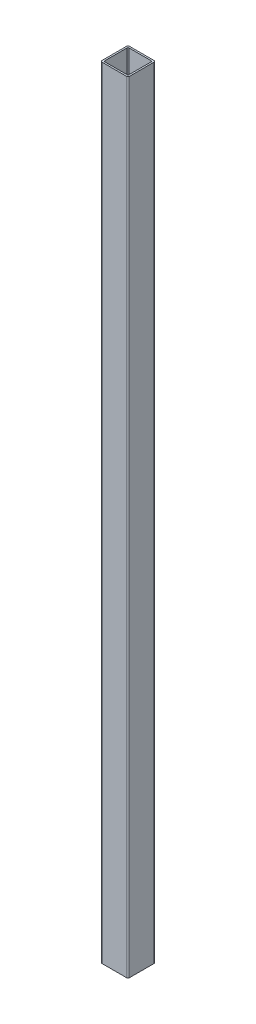
ISO-10303-21;
HEADER;
FILE_DESCRIPTION(('STEP AP214'),'2;1');
FILE_NAME('part.step','',(''),(''),'','','');
FILE_SCHEMA(('AUTOMOTIVE_DESIGN { 1 0 10303 214 1 1 1 1 }'));
ENDSEC;
DATA;
#1=APPLICATION_CONTEXT('core data for automotive mechanical design processes');
#2=APPLICATION_PROTOCOL_DEFINITION('international standard','automotive_design',2000,#1);
#3=PRODUCT_CONTEXT('',#1,'mechanical');
#4=PRODUCT('Part','Part','',(#3));
#5=PRODUCT_RELATED_PRODUCT_CATEGORY('part','',(#4));
#6=PRODUCT_DEFINITION_FORMATION('','',#4);
#7=PRODUCT_DEFINITION_CONTEXT('part definition',#1,'design');
#8=PRODUCT_DEFINITION('design','',#6,#7);
#9=PRODUCT_DEFINITION_SHAPE('','',#8);
#10=(LENGTH_UNIT() NAMED_UNIT(*) SI_UNIT(.MILLI.,.METRE.));
#11=(NAMED_UNIT(*) PLANE_ANGLE_UNIT() SI_UNIT($,.RADIAN.));
#12=(NAMED_UNIT(*) SI_UNIT($,.STERADIAN.) SOLID_ANGLE_UNIT());
#13=UNCERTAINTY_MEASURE_WITH_UNIT(LENGTH_MEASURE(1.E-05),#10,'distance_accuracy_value','');
#14=(GEOMETRIC_REPRESENTATION_CONTEXT(3) GLOBAL_UNCERTAINTY_ASSIGNED_CONTEXT((#13)) GLOBAL_UNIT_ASSIGNED_CONTEXT((#10,
#11,#12)) REPRESENTATION_CONTEXT('',''));
#15=CARTESIAN_POINT('',(0.,0.,0.));
#16=DIRECTION('',(0.,0.,1.));
#17=DIRECTION('',(1.,0.,0.));
#18=AXIS2_PLACEMENT_3D('',#15,#16,#17);
#19=CARTESIAN_POINT('',(-50.0000000000034,2983.95827270229,-43.9999999999733));
#20=DIRECTION('',(1.,0.,0.));
#21=DIRECTION('',(0.,0.,-1.));
#22=AXIS2_PLACEMENT_3D('',#19,#20,#21);
#23=PLANE('',#22);
#24=DIRECTION('',(0.,0.,1.));
#25=VECTOR('',#24,1.);
#26=CARTESIAN_POINT('',(-50.0000000000034,2842.53691646498,-43.9999999999733));
#27=LINE('',#26,#25);
#28=CARTESIAN_POINT('',(-50.0000000000034,2842.53691646498,-43.9999999999733));
#29=VERTEX_POINT('',#28);
#30=CARTESIAN_POINT('',(-50.0000000000034,2842.53691646498,44.0000000000267));
#31=VERTEX_POINT('',#30);
#32=EDGE_CURVE('E306',#29,#31,#27,.T.);
#33=ORIENTED_EDGE('',*,*,#32,.F.);
#34=DIRECTION('',(0.,-1.,0.));
#35=VECTOR('',#34,1.);
#36=CARTESIAN_POINT('',(-50.0000000000034,2983.95827270229,-43.9999999999733));
#37=LINE('',#36,#35);
#38=CARTESIAN_POINT('',(-50.0000000000034,0.,-43.9999999999733));
#39=VERTEX_POINT('',#38);
#40=EDGE_CURVE('E50',#29,#39,#37,.T.);
#41=ORIENTED_EDGE('',*,*,#40,.T.);
#42=DIRECTION('',(0.,0.,1.));
#43=VECTOR('',#42,1.);
#44=CARTESIAN_POINT('',(-50.0000000000034,0.,-43.9999999999733));
#45=LINE('',#44,#43);
#46=CARTESIAN_POINT('',(-50.0000000000034,0.,44.0000000000267));
#47=VERTEX_POINT('',#46);
#48=EDGE_CURVE('E201',#39,#47,#45,.T.);
#49=ORIENTED_EDGE('',*,*,#48,.T.);
#50=DIRECTION('',(0.,-1.,0.));
#51=VECTOR('',#50,1.);
#52=CARTESIAN_POINT('',(-50.0000000000034,2983.95827270229,44.0000000000267));
#53=LINE('',#52,#51);
#54=EDGE_CURVE('E204',#31,#47,#53,.T.);
#55=ORIENTED_EDGE('',*,*,#54,.F.);
#56=EDGE_LOOP('',(#33,#41,#49,#55));
#57=FACE_BOUND('',#56,.T.);
#58=ADVANCED_FACE('F35',(#57),#23,.F.);
#59=CARTESIAN_POINT('',(-44.0000000000031,2983.95827270229,-43.9999999999733));
#60=DIRECTION('',(0.,-1.,0.));
#61=DIRECTION('',(0.,0.,-1.));
#62=AXIS2_PLACEMENT_3D('',#59,#60,#61);
#63=CYLINDRICAL_SURFACE('',#62,6.00000000000014);
#64=CARTESIAN_POINT('',(-44.0000000000031,2842.53691646498,-43.9999999999733));
#65=DIRECTION('',(0.,1.,0.));
#66=DIRECTION('',(0.,0.,1.));
#67=AXIS2_PLACEMENT_3D('',#64,#65,#66);
#68=CIRCLE('',#67,6.00000000000014);
#69=CARTESIAN_POINT('',(-44.0000000000031,2842.53691646498,-49.9999999999734));
#70=VERTEX_POINT('',#69);
#71=EDGE_CURVE('E242',#70,#29,#68,.T.);
#72=ORIENTED_EDGE('',*,*,#71,.F.);
#73=DIRECTION('',(0.,-1.,0.));
#74=VECTOR('',#73,1.);
#75=CARTESIAN_POINT('',(-44.0000000000031,2983.95827270229,-49.9999999999734));
#76=LINE('',#75,#74);
#77=CARTESIAN_POINT('',(-44.0000000000031,0.,-49.9999999999734));
#78=VERTEX_POINT('',#77);
#79=EDGE_CURVE('E207',#70,#78,#76,.T.);
#80=ORIENTED_EDGE('',*,*,#79,.T.);
#81=CARTESIAN_POINT('',(-44.0000000000031,0.,-43.9999999999733));
#82=DIRECTION('',(0.,1.,0.));
#83=DIRECTION('',(0.,0.,1.));
#84=AXIS2_PLACEMENT_3D('',#81,#82,#83);
#85=CIRCLE('',#84,6.00000000000014);
#86=EDGE_CURVE('E199',#78,#39,#85,.T.);
#87=ORIENTED_EDGE('',*,*,#86,.T.);
#88=ORIENTED_EDGE('',*,*,#40,.F.);
#89=EDGE_LOOP('',(#72,#80,#87,#88));
#90=FACE_BOUND('',#89,.T.);
#91=ADVANCED_FACE('F239',(#90),#63,.T.);
#92=CARTESIAN_POINT('',(-44.0000000000031,2983.95827270229,-49.9999999999733));
#93=DIRECTION('',(0.,0.,1.));
#94=DIRECTION('',(1.,0.,0.));
#95=AXIS2_PLACEMENT_3D('',#92,#93,#94);
#96=PLANE('',#95);
#97=DIRECTION('',(-1.,0.,0.));
#98=VECTOR('',#97,1.);
#99=CARTESIAN_POINT('',(-44.0000000000031,2842.53691646498,-49.9999999999733));
#100=LINE('',#99,#98);
#101=CARTESIAN_POINT('',(43.999999999996,2842.53691646498,-49.9999999999733));
#102=VERTEX_POINT('',#101);
#103=EDGE_CURVE('E247',#102,#70,#100,.T.);
#104=ORIENTED_EDGE('',*,*,#103,.F.);
#105=DIRECTION('',(0.,-1.,0.));
#106=VECTOR('',#105,1.);
#107=CARTESIAN_POINT('',(43.999999999996,2983.95827270229,-49.9999999999733));
#108=LINE('',#107,#106);
#109=CARTESIAN_POINT('',(43.999999999996,0.,-49.9999999999733));
#110=VERTEX_POINT('',#109);
#111=EDGE_CURVE('E209',#102,#110,#108,.T.);
#112=ORIENTED_EDGE('',*,*,#111,.T.);
#113=DIRECTION('',(-1.,0.,0.));
#114=VECTOR('',#113,1.);
#115=CARTESIAN_POINT('',(-44.0000000000031,0.,-49.9999999999733));
#116=LINE('',#115,#114);
#117=EDGE_CURVE('E196',#110,#78,#116,.T.);
#118=ORIENTED_EDGE('',*,*,#117,.T.);
#119=ORIENTED_EDGE('',*,*,#79,.F.);
#120=EDGE_LOOP('',(#104,#112,#118,#119));
#121=FACE_BOUND('',#120,.T.);
#122=ADVANCED_FACE('F245',(#121),#96,.F.);
#123=CARTESIAN_POINT('',(43.999999999996,2983.95827270229,-43.9999999999733));
#124=DIRECTION('',(0.,-1.,0.));
#125=DIRECTION('',(0.,0.,-1.));
#126=AXIS2_PLACEMENT_3D('',#123,#124,#125);
#127=CYLINDRICAL_SURFACE('',#126,6.00000000000014);
#128=CARTESIAN_POINT('',(43.999999999996,2842.53691646498,-43.9999999999733));
#129=DIRECTION('',(0.,1.,0.));
#130=DIRECTION('',(0.,0.,1.));
#131=AXIS2_PLACEMENT_3D('',#128,#129,#130);
#132=CIRCLE('',#131,6.00000000000014);
#133=CARTESIAN_POINT('',(49.9999999999962,2842.53691646498,-43.9999999999733));
#134=VERTEX_POINT('',#133);
#135=EDGE_CURVE('E310',#134,#102,#132,.T.);
#136=ORIENTED_EDGE('',*,*,#135,.F.);
#137=DIRECTION('',(0.,-1.,0.));
#138=VECTOR('',#137,1.);
#139=CARTESIAN_POINT('',(49.9999999999962,2983.95827270229,-43.9999999999733));
#140=LINE('',#139,#138);
#141=CARTESIAN_POINT('',(49.9999999999962,0.,-43.9999999999733));
#142=VERTEX_POINT('',#141);
#143=EDGE_CURVE('E211',#134,#142,#140,.T.);
#144=ORIENTED_EDGE('',*,*,#143,.T.);
#145=CARTESIAN_POINT('',(43.999999999996,0.,-43.9999999999733));
#146=DIRECTION('',(0.,1.,0.));
#147=DIRECTION('',(0.,0.,-1.));
#148=AXIS2_PLACEMENT_3D('',#145,#146,#147);
#149=CIRCLE('',#148,6.00000000000014);
#150=EDGE_CURVE('E193',#142,#110,#149,.T.);
#151=ORIENTED_EDGE('',*,*,#150,.T.);
#152=ORIENTED_EDGE('',*,*,#111,.F.);
#153=EDGE_LOOP('',(#136,#144,#151,#152));
#154=FACE_BOUND('',#153,.T.);
#155=ADVANCED_FACE('F250',(#154),#127,.T.);
#156=CARTESIAN_POINT('',(49.9999999999963,2983.95827270229,-43.9999999999733));
#157=DIRECTION('',(-1.,0.,0.));
#158=DIRECTION('',(0.,0.,1.));
#159=AXIS2_PLACEMENT_3D('',#156,#157,#158);
#160=PLANE('',#159);
#161=DIRECTION('',(0.,0.,-1.));
#162=VECTOR('',#161,1.);
#163=CARTESIAN_POINT('',(49.9999999999963,2842.53691646498,-43.9999999999733));
#164=LINE('',#163,#162);
#165=CARTESIAN_POINT('',(49.9999999999963,2842.53691646498,44.0000000000267));
#166=VERTEX_POINT('',#165);
#167=EDGE_CURVE('E256',#166,#134,#164,.T.);
#168=ORIENTED_EDGE('',*,*,#167,.F.);
#169=DIRECTION('',(0.,-1.,0.));
#170=VECTOR('',#169,1.);
#171=CARTESIAN_POINT('',(49.9999999999963,2983.95827270229,44.0000000000267));
#172=LINE('',#171,#170);
#173=CARTESIAN_POINT('',(49.9999999999963,0.,44.0000000000267));
#174=VERTEX_POINT('',#173);
#175=EDGE_CURVE('E213',#166,#174,#172,.T.);
#176=ORIENTED_EDGE('',*,*,#175,.T.);
#177=DIRECTION('',(0.,0.,-1.));
#178=VECTOR('',#177,1.);
#179=CARTESIAN_POINT('',(49.9999999999963,0.,-43.9999999999733));
#180=LINE('',#179,#178);
#181=EDGE_CURVE('E190',#174,#142,#180,.T.);
#182=ORIENTED_EDGE('',*,*,#181,.T.);
#183=ORIENTED_EDGE('',*,*,#143,.F.);
#184=EDGE_LOOP('',(#168,#176,#182,#183));
#185=FACE_BOUND('',#184,.T.);
#186=ADVANCED_FACE('F253',(#185),#160,.F.);
#187=CARTESIAN_POINT('',(43.999999999996,2983.95827270229,44.0000000000267));
#188=DIRECTION('',(0.,-1.,0.));
#189=DIRECTION('',(0.,0.,-1.));
#190=AXIS2_PLACEMENT_3D('',#187,#188,#189);
#191=CYLINDRICAL_SURFACE('',#190,6.00000000000014);
#192=CARTESIAN_POINT('',(43.999999999996,2842.53691646498,44.0000000000267));
#193=DIRECTION('',(0.,1.,0.));
#194=DIRECTION('',(0.,0.,1.));
#195=AXIS2_PLACEMENT_3D('',#192,#193,#194);
#196=CIRCLE('',#195,6.00000000000014);
#197=CARTESIAN_POINT('',(43.999999999996,2842.53691646498,50.0000000000268));
#198=VERTEX_POINT('',#197);
#199=EDGE_CURVE('E260',#198,#166,#196,.T.);
#200=ORIENTED_EDGE('',*,*,#199,.F.);
#201=DIRECTION('',(0.,-1.,0.));
#202=VECTOR('',#201,1.);
#203=CARTESIAN_POINT('',(43.999999999996,2983.95827270229,50.0000000000268));
#204=LINE('',#203,#202);
#205=CARTESIAN_POINT('',(43.999999999996,0.,50.0000000000268));
#206=VERTEX_POINT('',#205);
#207=EDGE_CURVE('E215',#198,#206,#204,.T.);
#208=ORIENTED_EDGE('',*,*,#207,.T.);
#209=CARTESIAN_POINT('',(43.999999999996,0.,44.0000000000267));
#210=DIRECTION('',(0.,1.,0.));
#211=DIRECTION('',(0.,0.,1.));
#212=AXIS2_PLACEMENT_3D('',#209,#210,#211);
#213=CIRCLE('',#212,6.00000000000014);
#214=EDGE_CURVE('E187',#206,#174,#213,.T.);
#215=ORIENTED_EDGE('',*,*,#214,.T.);
#216=ORIENTED_EDGE('',*,*,#175,.F.);
#217=EDGE_LOOP('',(#200,#208,#215,#216));
#218=FACE_BOUND('',#217,.T.);
#219=ADVANCED_FACE('F259',(#218),#191,.T.);
#220=CARTESIAN_POINT('',(-44.0000000000031,2983.95827270229,50.0000000000267));
#221=DIRECTION('',(0.,0.,-1.));
#222=DIRECTION('',(-1.,0.,0.));
#223=AXIS2_PLACEMENT_3D('',#220,#221,#222);
#224=PLANE('',#223);
#225=DIRECTION('',(1.,0.,0.));
#226=VECTOR('',#225,1.);
#227=CARTESIAN_POINT('',(-44.0000000000031,2842.53691646498,50.0000000000267));
#228=LINE('',#227,#226);
#229=CARTESIAN_POINT('',(-44.0000000000031,2842.53691646498,50.0000000000267));
#230=VERTEX_POINT('',#229);
#231=EDGE_CURVE('E223',#230,#198,#228,.T.);
#232=ORIENTED_EDGE('',*,*,#231,.F.);
#233=DIRECTION('',(0.,-1.,0.));
#234=VECTOR('',#233,1.);
#235=CARTESIAN_POINT('',(-44.0000000000031,2983.95827270229,50.0000000000267));
#236=LINE('',#235,#234);
#237=CARTESIAN_POINT('',(-44.0000000000031,0.,50.0000000000267));
#238=VERTEX_POINT('',#237);
#239=EDGE_CURVE('E43',#230,#238,#236,.T.);
#240=ORIENTED_EDGE('',*,*,#239,.T.);
#241=DIRECTION('',(1.,0.,0.));
#242=VECTOR('',#241,1.);
#243=CARTESIAN_POINT('',(-44.0000000000031,0.,50.0000000000267));
#244=LINE('',#243,#242);
#245=EDGE_CURVE('E184',#238,#206,#244,.T.);
#246=ORIENTED_EDGE('',*,*,#245,.T.);
#247=ORIENTED_EDGE('',*,*,#207,.F.);
#248=EDGE_LOOP('',(#232,#240,#246,#247));
#249=FACE_BOUND('',#248,.T.);
#250=ADVANCED_FACE('F219',(#249),#224,.F.);
#251=CARTESIAN_POINT('',(-44.0000000000031,2983.95827270229,44.0000000000267));
#252=DIRECTION('',(0.,-1.,0.));
#253=DIRECTION('',(0.,0.,-1.));
#254=AXIS2_PLACEMENT_3D('',#251,#252,#253);
#255=CYLINDRICAL_SURFACE('',#254,6.00000000000014);
#256=CARTESIAN_POINT('',(-44.0000000000031,2842.53691646498,44.0000000000267));
#257=DIRECTION('',(0.,1.,0.));
#258=DIRECTION('',(0.,0.,1.));
#259=AXIS2_PLACEMENT_3D('',#256,#257,#258);
#260=CIRCLE('',#259,6.00000000000014);
#261=EDGE_CURVE('E233',#31,#230,#260,.T.);
#262=ORIENTED_EDGE('',*,*,#261,.F.);
#263=ORIENTED_EDGE('',*,*,#54,.T.);
#264=CARTESIAN_POINT('',(-44.0000000000031,0.,44.0000000000267));
#265=DIRECTION('',(0.,1.,0.));
#266=DIRECTION('',(0.,0.,1.));
#267=AXIS2_PLACEMENT_3D('',#264,#265,#266);
#268=CIRCLE('',#267,6.00000000000014);
#269=EDGE_CURVE('E181',#47,#238,#268,.T.);
#270=ORIENTED_EDGE('',*,*,#269,.T.);
#271=ORIENTED_EDGE('',*,*,#239,.F.);
#272=EDGE_LOOP('',(#262,#263,#270,#271));
#273=FACE_BOUND('',#272,.T.);
#274=ADVANCED_FACE('F37',(#273),#255,.T.);
#275=CARTESIAN_POINT('',(-44.0000000000031,0.,44.0000000000267));
#276=DIRECTION('',(0.,1.,0.));
#277=DIRECTION('',(0.,0.,1.));
#278=AXIS2_PLACEMENT_3D('',#275,#276,#277);
#279=PLANE('',#278);
#280=ORIENTED_EDGE('',*,*,#269,.F.);
#281=ORIENTED_EDGE('',*,*,#48,.F.);
#282=ORIENTED_EDGE('',*,*,#86,.F.);
#283=ORIENTED_EDGE('',*,*,#117,.F.);
#284=ORIENTED_EDGE('',*,*,#150,.F.);
#285=ORIENTED_EDGE('',*,*,#181,.F.);
#286=ORIENTED_EDGE('',*,*,#214,.F.);
#287=ORIENTED_EDGE('',*,*,#245,.F.);
#288=EDGE_LOOP('',(#280,#281,#282,#283,#284,#285,#286,#287));
#289=FACE_BOUND('',#288,.T.);
#290=CARTESIAN_POINT('',(-40.0000000000045,0.,40.0000000000267));
#291=DIRECTION('',(0.,1.,0.));
#292=DIRECTION('',(0.,0.,1.));
#293=AXIS2_PLACEMENT_3D('',#290,#291,#292);
#294=CIRCLE('',#293,3.99999999999978);
#295=CARTESIAN_POINT('',(-44.000000000004,0.,40.0000000000267));
#296=VERTEX_POINT('',#295);
#297=CARTESIAN_POINT('',(-40.0000000000045,0.,44.0000000000267));
#298=VERTEX_POINT('',#297);
#299=EDGE_CURVE('E262',#296,#298,#294,.T.);
#300=ORIENTED_EDGE('',*,*,#299,.T.);
#301=DIRECTION('',(1.,0.,0.));
#302=VECTOR('',#301,1.);
#303=CARTESIAN_POINT('',(-40.0000000000045,0.,44.0000000000267));
#304=LINE('',#303,#302);
#305=CARTESIAN_POINT('',(39.9999999999974,0.,44.0000000000265));
#306=VERTEX_POINT('',#305);
#307=EDGE_CURVE('E269',#298,#306,#304,.T.);
#308=ORIENTED_EDGE('',*,*,#307,.T.);
#309=CARTESIAN_POINT('',(39.9999999999974,0.,40.0000000000267));
#310=DIRECTION('',(0.,1.,0.));
#311=DIRECTION('',(0.,0.,1.));
#312=AXIS2_PLACEMENT_3D('',#309,#310,#311);
#313=CIRCLE('',#312,3.99999999999978);
#314=CARTESIAN_POINT('',(43.9999999999969,0.,40.0000000000267));
#315=VERTEX_POINT('',#314);
#316=EDGE_CURVE('E272',#306,#315,#313,.T.);
#317=ORIENTED_EDGE('',*,*,#316,.T.);
#318=DIRECTION('',(0.,0.,-1.));
#319=VECTOR('',#318,1.);
#320=CARTESIAN_POINT('',(43.9999999999969,0.,-39.9999999999733));
#321=LINE('',#320,#319);
#322=CARTESIAN_POINT('',(43.9999999999972,0.,-39.9999999999733));
#323=VERTEX_POINT('',#322);
#324=EDGE_CURVE('E275',#315,#323,#321,.T.);
#325=ORIENTED_EDGE('',*,*,#324,.T.);
#326=CARTESIAN_POINT('',(39.9999999999974,0.,-39.9999999999733));
#327=DIRECTION('',(0.,1.,0.));
#328=DIRECTION('',(0.,0.,-1.));
#329=AXIS2_PLACEMENT_3D('',#326,#327,#328);
#330=CIRCLE('',#329,3.99999999999978);
#331=CARTESIAN_POINT('',(39.9999999999974,0.,-43.9999999999733));
#332=VERTEX_POINT('',#331);
#333=EDGE_CURVE('E278',#323,#332,#330,.T.);
#334=ORIENTED_EDGE('',*,*,#333,.T.);
#335=DIRECTION('',(-1.,0.,0.));
#336=VECTOR('',#335,1.);
#337=CARTESIAN_POINT('',(-40.0000000000045,0.,-43.9999999999733));
#338=LINE('',#337,#336);
#339=CARTESIAN_POINT('',(-40.0000000000045,0.,-43.9999999999731));
#340=VERTEX_POINT('',#339);
#341=EDGE_CURVE('E281',#332,#340,#338,.T.);
#342=ORIENTED_EDGE('',*,*,#341,.T.);
#343=CARTESIAN_POINT('',(-40.0000000000045,0.,-39.9999999999733));
#344=DIRECTION('',(0.,1.,0.));
#345=DIRECTION('',(0.,0.,1.));
#346=AXIS2_PLACEMENT_3D('',#343,#344,#345);
#347=CIRCLE('',#346,3.99999999999978);
#348=CARTESIAN_POINT('',(-44.000000000004,0.,-39.9999999999733));
#349=VERTEX_POINT('',#348);
#350=EDGE_CURVE('E284',#340,#349,#347,.T.);
#351=ORIENTED_EDGE('',*,*,#350,.T.);
#352=DIRECTION('',(0.,0.,1.));
#353=VECTOR('',#352,1.);
#354=CARTESIAN_POINT('',(-44.000000000004,0.,-39.9999999999733));
#355=LINE('',#354,#353);
#356=EDGE_CURVE('E163',#349,#296,#355,.T.);
#357=ORIENTED_EDGE('',*,*,#356,.T.);
#358=EDGE_LOOP('',(#300,#308,#317,#325,#334,#342,#351,#357));
#359=FACE_BOUND('',#358,.T.);
#360=ADVANCED_FACE('F229',(#289,#359),#279,.F.);
#361=CARTESIAN_POINT('',(-44.000000000004,2983.95827270229,-39.9999999999733));
#362=DIRECTION('',(1.,0.,0.));
#363=DIRECTION('',(0.,0.,-1.));
#364=AXIS2_PLACEMENT_3D('',#361,#362,#363);
#365=PLANE('',#364);
#366=DIRECTION('',(0.,-1.,0.));
#367=VECTOR('',#366,1.);
#368=CARTESIAN_POINT('',(-44.000000000004,2983.95827270229,-39.9999999999733));
#369=LINE('',#368,#367);
#370=CARTESIAN_POINT('',(-44.000000000004,2842.53691646498,-39.9999999999733));
#371=VERTEX_POINT('',#370);
#372=EDGE_CURVE('E155',#371,#349,#369,.T.);
#373=ORIENTED_EDGE('',*,*,#372,.F.);
#374=DIRECTION('',(0.,0.,1.));
#375=VECTOR('',#374,1.);
#376=CARTESIAN_POINT('',(-44.000000000004,2842.53691646498,-39.9999999999733));
#377=LINE('',#376,#375);
#378=CARTESIAN_POINT('',(-44.000000000004,2842.53691646498,40.0000000000267));
#379=VERTEX_POINT('',#378);
#380=EDGE_CURVE('E11',#371,#379,#377,.T.);
#381=ORIENTED_EDGE('',*,*,#380,.T.);
#382=DIRECTION('',(0.,-1.,0.));
#383=VECTOR('',#382,1.);
#384=CARTESIAN_POINT('',(-44.000000000004,2983.95827270229,40.0000000000267));
#385=LINE('',#384,#383);
#386=EDGE_CURVE('E165',#379,#296,#385,.T.);
#387=ORIENTED_EDGE('',*,*,#386,.T.);
#388=ORIENTED_EDGE('',*,*,#356,.F.);
#389=EDGE_LOOP('',(#373,#381,#387,#388));
#390=FACE_BOUND('',#389,.T.);
#391=ADVANCED_FACE('F161',(#390),#365,.T.);
#392=CARTESIAN_POINT('',(-40.0000000000045,2983.95827270229,-39.9999999999733));
#393=DIRECTION('',(0.,-1.,0.));
#394=DIRECTION('',(0.,0.,-1.));
#395=AXIS2_PLACEMENT_3D('',#392,#393,#394);
#396=CYLINDRICAL_SURFACE('',#395,3.99999999999978);
#397=DIRECTION('',(0.,-1.,0.));
#398=VECTOR('',#397,1.);
#399=CARTESIAN_POINT('',(-40.0000000000045,2983.95827270229,-43.9999999999731));
#400=LINE('',#399,#398);
#401=CARTESIAN_POINT('',(-40.0000000000045,2842.53691646498,-43.9999999999731));
#402=VERTEX_POINT('',#401);
#403=EDGE_CURVE('E157',#402,#340,#400,.T.);
#404=ORIENTED_EDGE('',*,*,#403,.F.);
#405=CARTESIAN_POINT('',(-40.0000000000045,2842.53691646498,-39.9999999999733));
#406=DIRECTION('',(0.,1.,0.));
#407=DIRECTION('',(0.,0.,1.));
#408=AXIS2_PLACEMENT_3D('',#405,#406,#407);
#409=CIRCLE('',#408,3.99999999999978);
#410=EDGE_CURVE('E148',#402,#371,#409,.T.);
#411=ORIENTED_EDGE('',*,*,#410,.T.);
#412=ORIENTED_EDGE('',*,*,#372,.T.);
#413=ORIENTED_EDGE('',*,*,#350,.F.);
#414=EDGE_LOOP('',(#404,#411,#412,#413));
#415=FACE_BOUND('',#414,.T.);
#416=ADVANCED_FACE('F153',(#415),#396,.F.);
#417=CARTESIAN_POINT('',(-40.0000000000045,2983.95827270229,-43.9999999999733));
#418=DIRECTION('',(0.,0.,1.));
#419=DIRECTION('',(1.,0.,0.));
#420=AXIS2_PLACEMENT_3D('',#417,#418,#419);
#421=PLANE('',#420);
#422=DIRECTION('',(0.,-1.,0.));
#423=VECTOR('',#422,1.);
#424=CARTESIAN_POINT('',(39.9999999999974,2983.95827270229,-43.9999999999733));
#425=LINE('',#424,#423);
#426=CARTESIAN_POINT('',(39.9999999999974,2842.53691646498,-43.9999999999733));
#427=VERTEX_POINT('',#426);
#428=EDGE_CURVE('E167',#427,#332,#425,.T.);
#429=ORIENTED_EDGE('',*,*,#428,.F.);
#430=DIRECTION('',(-1.,0.,0.));
#431=VECTOR('',#430,1.);
#432=CARTESIAN_POINT('',(-40.0000000000045,2842.53691646498,-43.9999999999733));
#433=LINE('',#432,#431);
#434=EDGE_CURVE('E159',#427,#402,#433,.T.);
#435=ORIENTED_EDGE('',*,*,#434,.T.);
#436=ORIENTED_EDGE('',*,*,#403,.T.);
#437=ORIENTED_EDGE('',*,*,#341,.F.);
#438=EDGE_LOOP('',(#429,#435,#436,#437));
#439=FACE_BOUND('',#438,.T.);
#440=ADVANCED_FACE('F290',(#439),#421,.T.);
#441=CARTESIAN_POINT('',(39.9999999999974,2983.95827270229,-39.9999999999733));
#442=DIRECTION('',(0.,-1.,0.));
#443=DIRECTION('',(0.,0.,-1.));
#444=AXIS2_PLACEMENT_3D('',#441,#442,#443);
#445=CYLINDRICAL_SURFACE('',#444,3.99999999999978);
#446=DIRECTION('',(0.,-1.,0.));
#447=VECTOR('',#446,1.);
#448=CARTESIAN_POINT('',(43.9999999999972,2983.95827270229,-39.9999999999733));
#449=LINE('',#448,#447);
#450=CARTESIAN_POINT('',(43.9999999999972,2842.53691646498,-39.9999999999733));
#451=VERTEX_POINT('',#450);
#452=EDGE_CURVE('E173',#451,#323,#449,.T.);
#453=ORIENTED_EDGE('',*,*,#452,.F.);
#454=CARTESIAN_POINT('',(39.9999999999974,2842.53691646498,-39.9999999999733));
#455=DIRECTION('',(0.,1.,0.));
#456=DIRECTION('',(0.,0.,1.));
#457=AXIS2_PLACEMENT_3D('',#454,#455,#456);
#458=CIRCLE('',#457,3.99999999999978);
#459=EDGE_CURVE('E292',#451,#427,#458,.T.);
#460=ORIENTED_EDGE('',*,*,#459,.T.);
#461=ORIENTED_EDGE('',*,*,#428,.T.);
#462=ORIENTED_EDGE('',*,*,#333,.F.);
#463=EDGE_LOOP('',(#453,#460,#461,#462));
#464=FACE_BOUND('',#463,.T.);
#465=ADVANCED_FACE('F327',(#464),#445,.F.);
#466=CARTESIAN_POINT('',(43.9999999999969,2983.95827270229,-39.9999999999733));
#467=DIRECTION('',(-1.,0.,0.));
#468=DIRECTION('',(0.,0.,1.));
#469=AXIS2_PLACEMENT_3D('',#466,#467,#468);
#470=PLANE('',#469);
#471=DIRECTION('',(0.,-1.,0.));
#472=VECTOR('',#471,1.);
#473=CARTESIAN_POINT('',(43.9999999999969,2983.95827270229,40.0000000000267));
#474=LINE('',#473,#472);
#475=CARTESIAN_POINT('',(43.9999999999969,2842.53691646498,40.0000000000267));
#476=VERTEX_POINT('',#475);
#477=EDGE_CURVE('E175',#476,#315,#474,.T.);
#478=ORIENTED_EDGE('',*,*,#477,.F.);
#479=DIRECTION('',(0.,0.,-1.));
#480=VECTOR('',#479,1.);
#481=CARTESIAN_POINT('',(43.9999999999969,2842.53691646498,-39.9999999999733));
#482=LINE('',#481,#480);
#483=EDGE_CURVE('E294',#476,#451,#482,.T.);
#484=ORIENTED_EDGE('',*,*,#483,.T.);
#485=ORIENTED_EDGE('',*,*,#452,.T.);
#486=ORIENTED_EDGE('',*,*,#324,.F.);
#487=EDGE_LOOP('',(#478,#484,#485,#486));
#488=FACE_BOUND('',#487,.T.);
#489=ADVANCED_FACE('F324',(#488),#470,.T.);
#490=CARTESIAN_POINT('',(39.9999999999974,2983.95827270229,40.0000000000267));
#491=DIRECTION('',(0.,-1.,0.));
#492=DIRECTION('',(0.,0.,-1.));
#493=AXIS2_PLACEMENT_3D('',#490,#491,#492);
#494=CYLINDRICAL_SURFACE('',#493,3.99999999999978);
#495=DIRECTION('',(0.,-1.,0.));
#496=VECTOR('',#495,1.);
#497=CARTESIAN_POINT('',(39.9999999999974,2983.95827270229,44.0000000000265));
#498=LINE('',#497,#496);
#499=CARTESIAN_POINT('',(39.9999999999974,2842.53691646498,44.0000000000265));
#500=VERTEX_POINT('',#499);
#501=EDGE_CURVE('E177',#500,#306,#498,.T.);
#502=ORIENTED_EDGE('',*,*,#501,.F.);
#503=CARTESIAN_POINT('',(39.9999999999974,2842.53691646498,40.0000000000267));
#504=DIRECTION('',(0.,1.,0.));
#505=DIRECTION('',(0.,0.,1.));
#506=AXIS2_PLACEMENT_3D('',#503,#504,#505);
#507=CIRCLE('',#506,3.99999999999978);
#508=EDGE_CURVE('E299',#500,#476,#507,.T.);
#509=ORIENTED_EDGE('',*,*,#508,.T.);
#510=ORIENTED_EDGE('',*,*,#477,.T.);
#511=ORIENTED_EDGE('',*,*,#316,.F.);
#512=EDGE_LOOP('',(#502,#509,#510,#511));
#513=FACE_BOUND('',#512,.T.);
#514=ADVANCED_FACE('F321',(#513),#494,.F.);
#515=CARTESIAN_POINT('',(-40.0000000000045,2983.95827270229,44.0000000000267));
#516=DIRECTION('',(0.,0.,-1.));
#517=DIRECTION('',(-1.,0.,0.));
#518=AXIS2_PLACEMENT_3D('',#515,#516,#517);
#519=PLANE('',#518);
#520=DIRECTION('',(0.,-1.,0.));
#521=VECTOR('',#520,1.);
#522=CARTESIAN_POINT('',(-40.0000000000045,2983.95827270229,44.0000000000267));
#523=LINE('',#522,#521);
#524=CARTESIAN_POINT('',(-40.0000000000045,2842.53691646498,44.0000000000267));
#525=VERTEX_POINT('',#524);
#526=EDGE_CURVE('E179',#525,#298,#523,.T.);
#527=ORIENTED_EDGE('',*,*,#526,.F.);
#528=DIRECTION('',(1.,0.,0.));
#529=VECTOR('',#528,1.);
#530=CARTESIAN_POINT('',(-40.0000000000045,2842.53691646498,44.0000000000267));
#531=LINE('',#530,#529);
#532=EDGE_CURVE('E302',#525,#500,#531,.T.);
#533=ORIENTED_EDGE('',*,*,#532,.T.);
#534=ORIENTED_EDGE('',*,*,#501,.T.);
#535=ORIENTED_EDGE('',*,*,#307,.F.);
#536=EDGE_LOOP('',(#527,#533,#534,#535));
#537=FACE_BOUND('',#536,.T.);
#538=ADVANCED_FACE('F316',(#537),#519,.T.);
#539=CARTESIAN_POINT('',(-40.0000000000045,2983.95827270229,40.0000000000267));
#540=DIRECTION('',(0.,-1.,0.));
#541=DIRECTION('',(0.,0.,-1.));
#542=AXIS2_PLACEMENT_3D('',#539,#540,#541);
#543=CYLINDRICAL_SURFACE('',#542,3.99999999999978);
#544=ORIENTED_EDGE('',*,*,#386,.F.);
#545=CARTESIAN_POINT('',(-40.0000000000045,2842.53691646498,40.0000000000267));
#546=DIRECTION('',(0.,1.,0.));
#547=DIRECTION('',(0.,0.,1.));
#548=AXIS2_PLACEMENT_3D('',#545,#546,#547);
#549=CIRCLE('',#548,3.99999999999978);
#550=EDGE_CURVE('E58',#379,#525,#549,.T.);
#551=ORIENTED_EDGE('',*,*,#550,.T.);
#552=ORIENTED_EDGE('',*,*,#526,.T.);
#553=ORIENTED_EDGE('',*,*,#299,.F.);
#554=EDGE_LOOP('',(#544,#551,#552,#553));
#555=FACE_BOUND('',#554,.T.);
#556=ADVANCED_FACE('F312',(#555),#543,.F.);
#557=CARTESIAN_POINT('',(1553.56728673064,2842.53691646498,49.9999999999994));
#558=DIRECTION('',(0.,1.,0.));
#559=DIRECTION('',(0.,0.,1.));
#560=AXIS2_PLACEMENT_3D('',#557,#558,#559);
#561=PLANE('',#560);
#562=ORIENTED_EDGE('',*,*,#550,.F.);
#563=ORIENTED_EDGE('',*,*,#380,.F.);
#564=ORIENTED_EDGE('',*,*,#410,.F.);
#565=ORIENTED_EDGE('',*,*,#434,.F.);
#566=ORIENTED_EDGE('',*,*,#459,.F.);
#567=ORIENTED_EDGE('',*,*,#483,.F.);
#568=ORIENTED_EDGE('',*,*,#508,.F.);
#569=ORIENTED_EDGE('',*,*,#532,.F.);
#570=EDGE_LOOP('',(#562,#563,#564,#565,#566,#567,#568,#569));
#571=FACE_BOUND('',#570,.T.);
#572=ORIENTED_EDGE('',*,*,#32,.T.);
#573=ORIENTED_EDGE('',*,*,#261,.T.);
#574=ORIENTED_EDGE('',*,*,#231,.T.);
#575=ORIENTED_EDGE('',*,*,#199,.T.);
#576=ORIENTED_EDGE('',*,*,#167,.T.);
#577=ORIENTED_EDGE('',*,*,#135,.T.);
#578=ORIENTED_EDGE('',*,*,#103,.T.);
#579=ORIENTED_EDGE('',*,*,#71,.T.);
#580=EDGE_LOOP('',(#572,#573,#574,#575,#576,#577,#578,#579));
#581=FACE_BOUND('',#580,.T.);
#582=ADVANCED_FACE('F146',(#571,#581),#561,.T.);
#583=CLOSED_SHELL('',(#58,#91,#122,#155,#186,#219,#250,#274,#360,#391,#416,#440,#465,#489,#514,
#538,#556,#582));
#584=MANIFOLD_SOLID_BREP('B2',#583);
#585=ADVANCED_BREP_SHAPE_REPRESENTATION('',(#18,#584),#14);
#586=SHAPE_DEFINITION_REPRESENTATION(#9,#585);
ENDSEC;
END-ISO-10303-21;
